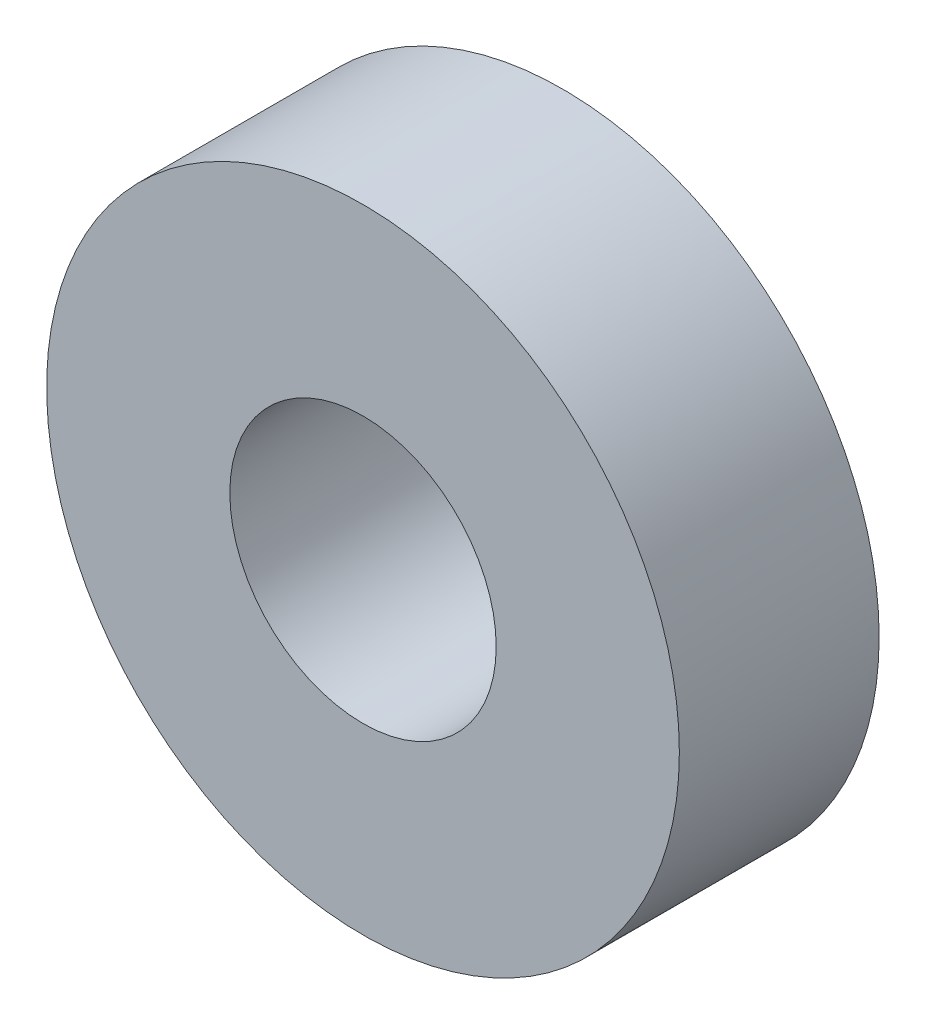
ISO-10303-21;
HEADER;
FILE_DESCRIPTION(('STEP AP214'),'2;1');
FILE_NAME('part.step','',(''),(''),'','','');
FILE_SCHEMA(('AUTOMOTIVE_DESIGN { 1 0 10303 214 1 1 1 1 }'));
ENDSEC;
DATA;
#1=APPLICATION_CONTEXT('core data for automotive mechanical design processes');
#2=APPLICATION_PROTOCOL_DEFINITION('international standard','automotive_design',2000,#1);
#3=PRODUCT_CONTEXT('',#1,'mechanical');
#4=PRODUCT('Part','Part','',(#3));
#5=PRODUCT_RELATED_PRODUCT_CATEGORY('part','',(#4));
#6=PRODUCT_DEFINITION_FORMATION('','',#4);
#7=PRODUCT_DEFINITION_CONTEXT('part definition',#1,'design');
#8=PRODUCT_DEFINITION('design','',#6,#7);
#9=PRODUCT_DEFINITION_SHAPE('','',#8);
#10=(LENGTH_UNIT() NAMED_UNIT(*) SI_UNIT(.MILLI.,.METRE.));
#11=(NAMED_UNIT(*) PLANE_ANGLE_UNIT() SI_UNIT($,.RADIAN.));
#12=(NAMED_UNIT(*) SI_UNIT($,.STERADIAN.) SOLID_ANGLE_UNIT());
#13=UNCERTAINTY_MEASURE_WITH_UNIT(LENGTH_MEASURE(1.E-05),#10,'distance_accuracy_value','');
#14=(GEOMETRIC_REPRESENTATION_CONTEXT(3) GLOBAL_UNCERTAINTY_ASSIGNED_CONTEXT((#13)) GLOBAL_UNIT_ASSIGNED_CONTEXT((#10,
#11,#12)) REPRESENTATION_CONTEXT('',''));
#15=CARTESIAN_POINT('',(0.,0.,0.));
#16=DIRECTION('',(0.,0.,1.));
#17=DIRECTION('',(1.,0.,0.));
#18=AXIS2_PLACEMENT_3D('',#15,#16,#17);
#19=CARTESIAN_POINT('',(13.8137814795,292.2514032978,3.));
#20=DIRECTION('',(0.,0.,1.));
#21=DIRECTION('',(1.,0.,0.));
#22=AXIS2_PLACEMENT_3D('',#19,#20,#21);
#23=PLANE('',#22);
#24=CARTESIAN_POINT('',(13.8137814795,292.2514032978,3.));
#25=DIRECTION('',(0.,0.,1.));
#26=DIRECTION('',(1.,0.,0.));
#27=AXIS2_PLACEMENT_3D('',#24,#25,#26);
#28=CIRCLE('',#27,4.75);
#29=CARTESIAN_POINT('',(18.5637814795,292.2514032978,3.));
#30=VERTEX_POINT('',#29);
#31=EDGE_CURVE('E10',#30,#30,#28,.T.);
#32=ORIENTED_EDGE('',*,*,#31,.T.);
#33=EDGE_LOOP('',(#32));
#34=FACE_BOUND('',#33,.T.);
#35=CARTESIAN_POINT('',(13.8137814795,292.2514032978,3.));
#36=DIRECTION('',(0.,0.,1.));
#37=DIRECTION('',(1.,0.,0.));
#38=AXIS2_PLACEMENT_3D('',#35,#36,#37);
#39=CIRCLE('',#38,1.99999999999997);
#40=CARTESIAN_POINT('',(15.8137814795,292.2514032978,3.));
#41=VERTEX_POINT('',#40);
#42=EDGE_CURVE('E41',#41,#41,#39,.T.);
#43=ORIENTED_EDGE('',*,*,#42,.F.);
#44=EDGE_LOOP('',(#43));
#45=FACE_BOUND('',#44,.T.);
#46=ADVANCED_FACE('F30',(#34,#45),#23,.T.);
#47=CARTESIAN_POINT('',(13.8137814795,292.2514032978,0.));
#48=DIRECTION('',(0.,0.,1.));
#49=DIRECTION('',(1.,0.,0.));
#50=AXIS2_PLACEMENT_3D('',#47,#48,#49);
#51=PLANE('',#50);
#52=CARTESIAN_POINT('',(13.8137814795,292.2514032978,0.));
#53=DIRECTION('',(0.,0.,1.));
#54=DIRECTION('',(1.,0.,0.));
#55=AXIS2_PLACEMENT_3D('',#52,#53,#54);
#56=CIRCLE('',#55,4.75);
#57=CARTESIAN_POINT('',(18.5637814795,292.2514032978,0.));
#58=VERTEX_POINT('',#57);
#59=EDGE_CURVE('E34',#58,#58,#56,.T.);
#60=ORIENTED_EDGE('',*,*,#59,.F.);
#61=EDGE_LOOP('',(#60));
#62=FACE_BOUND('',#61,.T.);
#63=CARTESIAN_POINT('',(13.8137814795,292.2514032978,0.));
#64=DIRECTION('',(0.,0.,1.));
#65=DIRECTION('',(1.,0.,0.));
#66=AXIS2_PLACEMENT_3D('',#63,#64,#65);
#67=CIRCLE('',#66,1.99999999999997);
#68=CARTESIAN_POINT('',(15.8137814795,292.2514032978,0.));
#69=VERTEX_POINT('',#68);
#70=EDGE_CURVE('E43',#69,#69,#67,.T.);
#71=ORIENTED_EDGE('',*,*,#70,.T.);
#72=EDGE_LOOP('',(#71));
#73=FACE_BOUND('',#72,.T.);
#74=ADVANCED_FACE('F53',(#62,#73),#51,.F.);
#75=CARTESIAN_POINT('',(13.8137814795,292.2514032978,3.));
#76=DIRECTION('',(0.,0.,-1.));
#77=DIRECTION('',(-1.,0.,0.));
#78=AXIS2_PLACEMENT_3D('',#75,#76,#77);
#79=CYLINDRICAL_SURFACE('',#78,4.75);
#80=ORIENTED_EDGE('',*,*,#31,.F.);
#81=EDGE_LOOP('',(#80));
#82=FACE_BOUND('',#81,.T.);
#83=ORIENTED_EDGE('',*,*,#59,.T.);
#84=EDGE_LOOP('',(#83));
#85=FACE_BOUND('',#84,.T.);
#86=ADVANCED_FACE('F32',(#82,#85),#79,.T.);
#87=CARTESIAN_POINT('',(13.8137814795,292.2514032978,3.));
#88=DIRECTION('',(0.,0.,-1.));
#89=DIRECTION('',(-1.,0.,0.));
#90=AXIS2_PLACEMENT_3D('',#87,#88,#89);
#91=CYLINDRICAL_SURFACE('',#90,1.99999999999997);
#92=ORIENTED_EDGE('',*,*,#42,.T.);
#93=EDGE_LOOP('',(#92));
#94=FACE_BOUND('',#93,.T.);
#95=ORIENTED_EDGE('',*,*,#70,.F.);
#96=EDGE_LOOP('',(#95));
#97=FACE_BOUND('',#96,.T.);
#98=ADVANCED_FACE('F49',(#94,#97),#91,.F.);
#99=CLOSED_SHELL('',(#46,#74,#86,#98));
#100=MANIFOLD_SOLID_BREP('B2',#99);
#101=ADVANCED_BREP_SHAPE_REPRESENTATION('',(#18,#100),#14);
#102=SHAPE_DEFINITION_REPRESENTATION(#9,#101);
ENDSEC;
END-ISO-10303-21;
